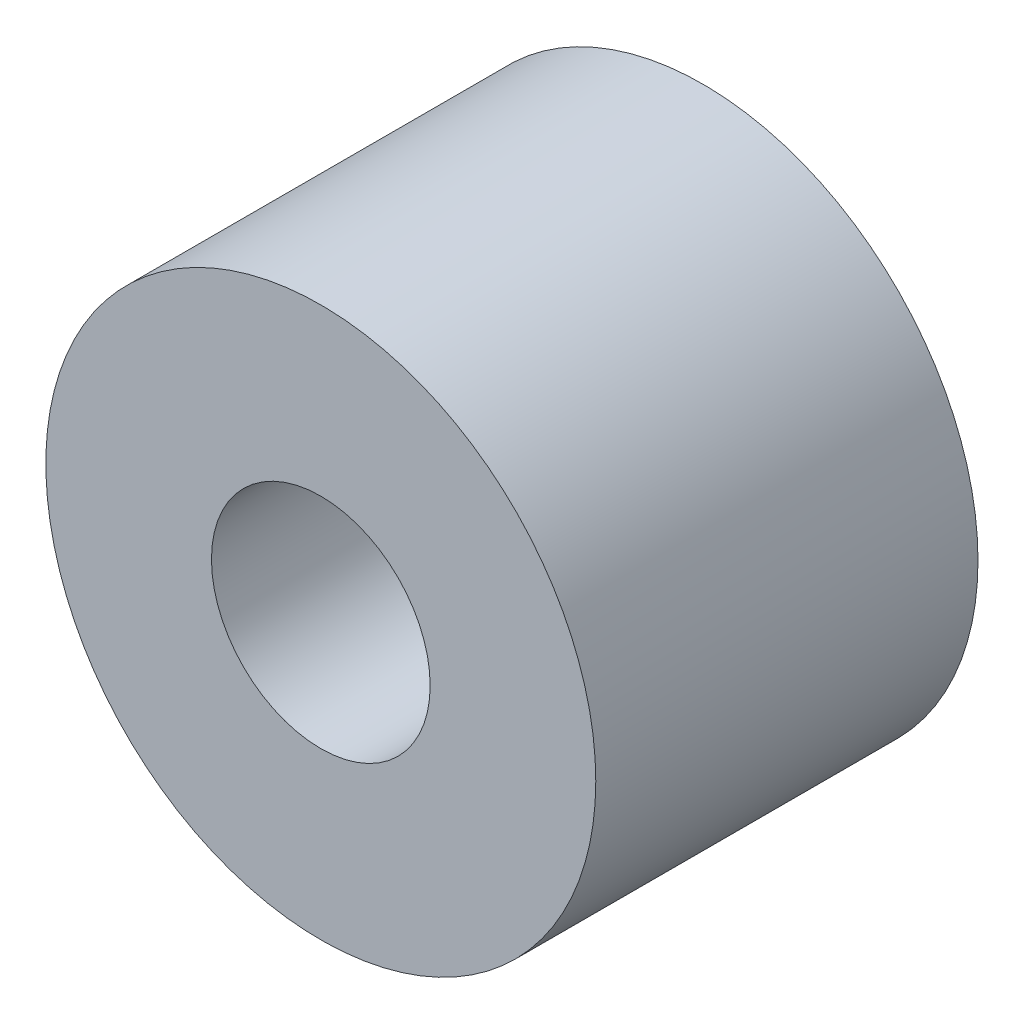
ISO-10303-21;
HEADER;
FILE_DESCRIPTION(('STEP AP214'),'2;1');
FILE_NAME('part.step','',(''),(''),'','','');
FILE_SCHEMA(('AUTOMOTIVE_DESIGN { 1 0 10303 214 1 1 1 1 }'));
ENDSEC;
DATA;
#1=APPLICATION_CONTEXT('core data for automotive mechanical design processes');
#2=APPLICATION_PROTOCOL_DEFINITION('international standard','automotive_design',2000,#1);
#3=PRODUCT_CONTEXT('',#1,'mechanical');
#4=PRODUCT('Part','Part','',(#3));
#5=PRODUCT_RELATED_PRODUCT_CATEGORY('part','',(#4));
#6=PRODUCT_DEFINITION_FORMATION('','',#4);
#7=PRODUCT_DEFINITION_CONTEXT('part definition',#1,'design');
#8=PRODUCT_DEFINITION('design','',#6,#7);
#9=PRODUCT_DEFINITION_SHAPE('','',#8);
#10=(LENGTH_UNIT() NAMED_UNIT(*) SI_UNIT(.MILLI.,.METRE.));
#11=(NAMED_UNIT(*) PLANE_ANGLE_UNIT() SI_UNIT($,.RADIAN.));
#12=(NAMED_UNIT(*) SI_UNIT($,.STERADIAN.) SOLID_ANGLE_UNIT());
#13=UNCERTAINTY_MEASURE_WITH_UNIT(LENGTH_MEASURE(1.E-05),#10,'distance_accuracy_value','');
#14=(GEOMETRIC_REPRESENTATION_CONTEXT(3) GLOBAL_UNCERTAINTY_ASSIGNED_CONTEXT((#13)) GLOBAL_UNIT_ASSIGNED_CONTEXT((#10,
#11,#12)) REPRESENTATION_CONTEXT('',''));
#15=CARTESIAN_POINT('',(0.,0.,0.));
#16=DIRECTION('',(0.,0.,1.));
#17=DIRECTION('',(1.,0.,0.));
#18=AXIS2_PLACEMENT_3D('',#15,#16,#17);
#19=CARTESIAN_POINT('',(0.,0.,18.));
#20=DIRECTION('',(0.,0.,1.));
#21=DIRECTION('',(1.,0.,0.));
#22=AXIS2_PLACEMENT_3D('',#19,#20,#21);
#23=PLANE('',#22);
#24=CARTESIAN_POINT('',(0.,0.,18.));
#25=DIRECTION('',(0.,0.,1.));
#26=DIRECTION('',(1.,0.,0.));
#27=AXIS2_PLACEMENT_3D('',#24,#25,#26);
#28=CIRCLE('',#27,12.95);
#29=CARTESIAN_POINT('',(12.95,0.,18.));
#30=VERTEX_POINT('',#29);
#31=EDGE_CURVE('E10',#30,#30,#28,.T.);
#32=ORIENTED_EDGE('',*,*,#31,.T.);
#33=EDGE_LOOP('',(#32));
#34=FACE_BOUND('',#33,.T.);
#35=CARTESIAN_POINT('',(0.,0.,18.));
#36=DIRECTION('',(0.,0.,1.));
#37=DIRECTION('',(1.,0.,0.));
#38=AXIS2_PLACEMENT_3D('',#35,#36,#37);
#39=CIRCLE('',#38,5.15);
#40=CARTESIAN_POINT('',(5.15,0.,18.));
#41=VERTEX_POINT('',#40);
#42=EDGE_CURVE('E42',#41,#41,#39,.T.);
#43=ORIENTED_EDGE('',*,*,#42,.F.);
#44=EDGE_LOOP('',(#43));
#45=FACE_BOUND('',#44,.T.);
#46=ADVANCED_FACE('F31',(#34,#45),#23,.T.);
#47=CARTESIAN_POINT('',(0.,0.,0.));
#48=DIRECTION('',(0.,0.,1.));
#49=DIRECTION('',(1.,0.,0.));
#50=AXIS2_PLACEMENT_3D('',#47,#48,#49);
#51=PLANE('',#50);
#52=CARTESIAN_POINT('',(0.,0.,0.));
#53=DIRECTION('',(0.,0.,1.));
#54=DIRECTION('',(1.,0.,0.));
#55=AXIS2_PLACEMENT_3D('',#52,#53,#54);
#56=CIRCLE('',#55,12.95);
#57=CARTESIAN_POINT('',(12.95,0.,0.));
#58=VERTEX_POINT('',#57);
#59=EDGE_CURVE('E35',#58,#58,#56,.T.);
#60=ORIENTED_EDGE('',*,*,#59,.F.);
#61=EDGE_LOOP('',(#60));
#62=FACE_BOUND('',#61,.T.);
#63=CARTESIAN_POINT('',(0.,0.,0.));
#64=DIRECTION('',(0.,0.,1.));
#65=DIRECTION('',(1.,0.,0.));
#66=AXIS2_PLACEMENT_3D('',#63,#64,#65);
#67=CIRCLE('',#66,5.15);
#68=CARTESIAN_POINT('',(5.15,0.,0.));
#69=VERTEX_POINT('',#68);
#70=EDGE_CURVE('E44',#69,#69,#67,.T.);
#71=ORIENTED_EDGE('',*,*,#70,.T.);
#72=EDGE_LOOP('',(#71));
#73=FACE_BOUND('',#72,.T.);
#74=ADVANCED_FACE('F54',(#62,#73),#51,.F.);
#75=CARTESIAN_POINT('',(0.,0.,18.));
#76=DIRECTION('',(0.,0.,-1.));
#77=DIRECTION('',(-1.,0.,0.));
#78=AXIS2_PLACEMENT_3D('',#75,#76,#77);
#79=CYLINDRICAL_SURFACE('',#78,12.95);
#80=ORIENTED_EDGE('',*,*,#31,.F.);
#81=EDGE_LOOP('',(#80));
#82=FACE_BOUND('',#81,.T.);
#83=ORIENTED_EDGE('',*,*,#59,.T.);
#84=EDGE_LOOP('',(#83));
#85=FACE_BOUND('',#84,.T.);
#86=ADVANCED_FACE('F33',(#82,#85),#79,.T.);
#87=CARTESIAN_POINT('',(0.,0.,18.));
#88=DIRECTION('',(0.,0.,-1.));
#89=DIRECTION('',(-1.,0.,0.));
#90=AXIS2_PLACEMENT_3D('',#87,#88,#89);
#91=CYLINDRICAL_SURFACE('',#90,5.15);
#92=ORIENTED_EDGE('',*,*,#42,.T.);
#93=EDGE_LOOP('',(#92));
#94=FACE_BOUND('',#93,.T.);
#95=ORIENTED_EDGE('',*,*,#70,.F.);
#96=EDGE_LOOP('',(#95));
#97=FACE_BOUND('',#96,.T.);
#98=ADVANCED_FACE('F50',(#94,#97),#91,.F.);
#99=CLOSED_SHELL('',(#46,#74,#86,#98));
#100=MANIFOLD_SOLID_BREP('B2',#99);
#101=ADVANCED_BREP_SHAPE_REPRESENTATION('',(#18,#100),#14);
#102=SHAPE_DEFINITION_REPRESENTATION(#9,#101);
ENDSEC;
END-ISO-10303-21;
